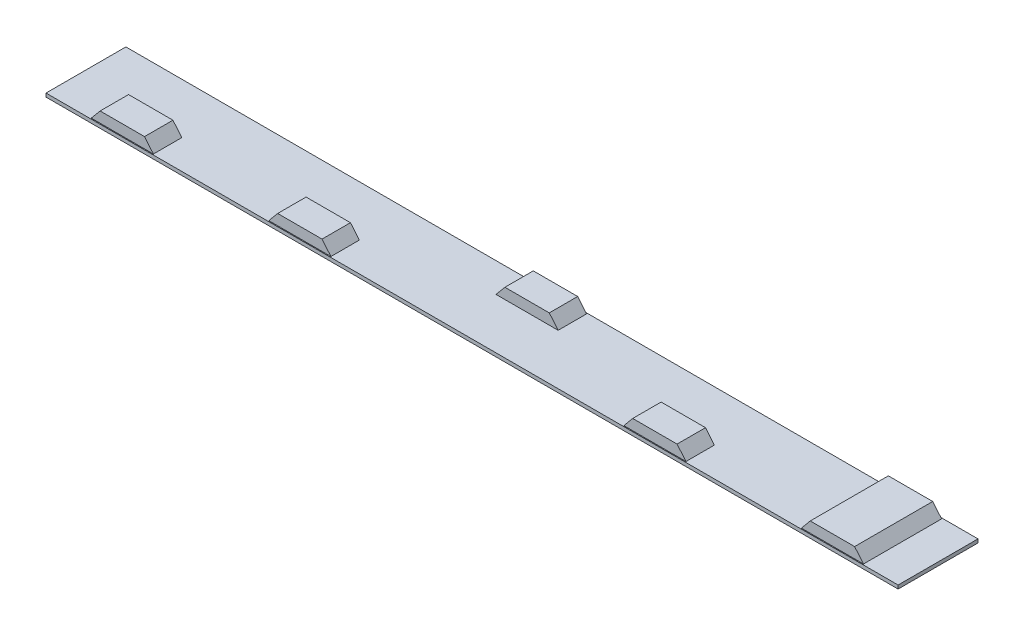
ISO-10303-21;
HEADER;
FILE_DESCRIPTION(('STEP AP214'),'2;1');
FILE_NAME('part.step','',(''),(''),'','','');
FILE_SCHEMA(('AUTOMOTIVE_DESIGN { 1 0 10303 214 1 1 1 1 }'));
ENDSEC;
DATA;
#1=APPLICATION_CONTEXT('core data for automotive mechanical design processes');
#2=APPLICATION_PROTOCOL_DEFINITION('international standard','automotive_design',2000,#1);
#3=PRODUCT_CONTEXT('',#1,'mechanical');
#4=PRODUCT('Part','Part','',(#3));
#5=PRODUCT_RELATED_PRODUCT_CATEGORY('part','',(#4));
#6=PRODUCT_DEFINITION_FORMATION('','',#4);
#7=PRODUCT_DEFINITION_CONTEXT('part definition',#1,'design');
#8=PRODUCT_DEFINITION('design','',#6,#7);
#9=PRODUCT_DEFINITION_SHAPE('','',#8);
#10=(LENGTH_UNIT() NAMED_UNIT(*) SI_UNIT(.MILLI.,.METRE.));
#11=(NAMED_UNIT(*) PLANE_ANGLE_UNIT() SI_UNIT($,.RADIAN.));
#12=(NAMED_UNIT(*) SI_UNIT($,.STERADIAN.) SOLID_ANGLE_UNIT());
#13=UNCERTAINTY_MEASURE_WITH_UNIT(LENGTH_MEASURE(1.E-05),#10,'distance_accuracy_value','');
#14=(GEOMETRIC_REPRESENTATION_CONTEXT(3) GLOBAL_UNCERTAINTY_ASSIGNED_CONTEXT((#13)) GLOBAL_UNIT_ASSIGNED_CONTEXT((#10,
#11,#12)) REPRESENTATION_CONTEXT('',''));
#15=CARTESIAN_POINT('',(0.,0.,0.));
#16=DIRECTION('',(0.,0.,1.));
#17=DIRECTION('',(1.,0.,0.));
#18=AXIS2_PLACEMENT_3D('',#15,#16,#17);
#19=CARTESIAN_POINT('',(0.,10.,0.));
#20=DIRECTION('',(0.,-1.,0.));
#21=DIRECTION('',(0.,0.,-1.));
#22=AXIS2_PLACEMENT_3D('',#19,#20,#21);
#23=PLANE('',#22);
#24=DIRECTION('',(0.,0.,-1.));
#25=VECTOR('',#24,1.);
#26=CARTESIAN_POINT('',(1100.,10.0000000000105,110.));
#27=LINE('',#26,#25);
#28=CARTESIAN_POINT('',(1100.00000000001,10.,110.));
#29=VERTEX_POINT('',#28);
#30=CARTESIAN_POINT('',(1100.00000000001,10.,-110.));
#31=VERTEX_POINT('',#30);
#32=EDGE_CURVE('E62',#29,#31,#27,.T.);
#33=ORIENTED_EDGE('',*,*,#32,.F.);
#34=DIRECTION('',(1.,0.,0.));
#35=VECTOR('',#34,1.);
#36=CARTESIAN_POINT('',(0.,10.0000000000105,110.));
#37=LINE('',#36,#35);
#38=CARTESIAN_POINT('',(924.999999999992,10.,110.));
#39=VERTEX_POINT('',#38);
#40=EDGE_CURVE('E57',#39,#29,#37,.T.);
#41=ORIENTED_EDGE('',*,*,#40,.F.);
#42=DIRECTION('',(0.,0.,-1.));
#43=VECTOR('',#42,1.);
#44=CARTESIAN_POINT('',(925.000000000001,10.0000000000105,110.));
#45=LINE('',#44,#43);
#46=CARTESIAN_POINT('',(925.000000000001,10.0000000000105,-110.));
#47=VERTEX_POINT('',#46);
#48=EDGE_CURVE('E212',#39,#47,#45,.T.);
#49=ORIENTED_EDGE('',*,*,#48,.T.);
#50=DIRECTION('',(1.,0.,0.));
#51=VECTOR('',#50,1.);
#52=CARTESIAN_POINT('',(0.,10.0000000000105,-110.));
#53=LINE('',#52,#51);
#54=EDGE_CURVE('E221',#47,#31,#53,.T.);
#55=ORIENTED_EDGE('',*,*,#54,.T.);
#56=EDGE_LOOP('',(#33,#41,#49,#55));
#57=FACE_BOUND('',#56,.T.);
#58=DIRECTION('',(0.,0.,-1.));
#59=VECTOR('',#58,1.);
#60=CARTESIAN_POINT('',(600.000000000001,10.0000000000105,110.));
#61=LINE('',#60,#59);
#62=CARTESIAN_POINT('',(600.000000000009,10.,110.));
#63=VERTEX_POINT('',#62);
#64=CARTESIAN_POINT('',(600.000000000009,10.,30.));
#65=VERTEX_POINT('',#64);
#66=EDGE_CURVE('E263',#63,#65,#61,.T.);
#67=ORIENTED_EDGE('',*,*,#66,.F.);
#68=DIRECTION('',(1.,0.,0.));
#69=VECTOR('',#68,1.);
#70=CARTESIAN_POINT('',(0.,10.0000000000105,110.));
#71=LINE('',#70,#69);
#72=CARTESIAN_POINT('',(424.999999999992,10.,110.));
#73=VERTEX_POINT('',#72);
#74=EDGE_CURVE('E247',#73,#63,#71,.T.);
#75=ORIENTED_EDGE('',*,*,#74,.F.);
#76=DIRECTION('',(0.,0.,-1.));
#77=VECTOR('',#76,1.);
#78=CARTESIAN_POINT('',(425.000000000001,10.0000000000105,110.));
#79=LINE('',#78,#77);
#80=CARTESIAN_POINT('',(425.000000000001,10.0000000000105,30.));
#81=VERTEX_POINT('',#80);
#82=EDGE_CURVE('E266',#73,#81,#79,.T.);
#83=ORIENTED_EDGE('',*,*,#82,.T.);
#84=DIRECTION('',(1.,0.,0.));
#85=VECTOR('',#84,1.);
#86=CARTESIAN_POINT('',(0.,10.0000000000105,30.));
#87=LINE('',#86,#85);
#88=EDGE_CURVE('E258',#81,#65,#87,.T.);
#89=ORIENTED_EDGE('',*,*,#88,.T.);
#90=EDGE_LOOP('',(#67,#75,#83,#89));
#91=FACE_BOUND('',#90,.T.);
#92=DIRECTION('',(0.,0.,1.));
#93=VECTOR('',#92,1.);
#94=CARTESIAN_POINT('',(-74.9999999999993,9.99999999999651,-110.));
#95=LINE('',#94,#93);
#96=CARTESIAN_POINT('',(-74.9999999999964,10.,-110.));
#97=VERTEX_POINT('',#96);
#98=CARTESIAN_POINT('',(-74.9999999999993,10.,-30.));
#99=VERTEX_POINT('',#98);
#100=EDGE_CURVE('E284',#97,#99,#95,.T.);
#101=ORIENTED_EDGE('',*,*,#100,.F.);
#102=DIRECTION('',(1.,0.,0.));
#103=VECTOR('',#102,1.);
#104=CARTESIAN_POINT('',(-74.9999999999993,9.99999999999651,-110.));
#105=LINE('',#104,#103);
#106=CARTESIAN_POINT('',(99.9999999999979,10.,-110.));
#107=VERTEX_POINT('',#106);
#108=EDGE_CURVE('E275',#97,#107,#105,.T.);
#109=ORIENTED_EDGE('',*,*,#108,.T.);
#110=DIRECTION('',(0.,0.,1.));
#111=VECTOR('',#110,1.);
#112=CARTESIAN_POINT('',(100.000000000001,9.99999999999651,-110.));
#113=LINE('',#112,#111);
#114=CARTESIAN_POINT('',(100.000000000001,9.99999999999651,-30.));
#115=VERTEX_POINT('',#114);
#116=EDGE_CURVE('E300',#107,#115,#113,.T.);
#117=ORIENTED_EDGE('',*,*,#116,.T.);
#118=DIRECTION('',(1.,0.,0.));
#119=VECTOR('',#118,1.);
#120=CARTESIAN_POINT('',(-74.9999999999993,9.99999999999651,-30.));
#121=LINE('',#120,#119);
#122=EDGE_CURVE('E287',#99,#115,#121,.T.);
#123=ORIENTED_EDGE('',*,*,#122,.F.);
#124=EDGE_LOOP('',(#101,#109,#117,#123));
#125=FACE_BOUND('',#124,.T.);
#126=DIRECTION('',(0.,0.,-1.));
#127=VECTOR('',#126,1.);
#128=CARTESIAN_POINT('',(-399.999999999999,9.99999999999302,110.));
#129=LINE('',#128,#127);
#130=CARTESIAN_POINT('',(-400.000000000005,10.,110.));
#131=VERTEX_POINT('',#130);
#132=CARTESIAN_POINT('',(-399.999999999999,10.,30.));
#133=VERTEX_POINT('',#132);
#134=EDGE_CURVE('E327',#131,#133,#129,.T.);
#135=ORIENTED_EDGE('',*,*,#134,.F.);
#136=DIRECTION('',(1.,0.,0.));
#137=VECTOR('',#136,1.);
#138=CARTESIAN_POINT('',(-574.999999999999,9.99999999999302,110.));
#139=LINE('',#138,#137);
#140=CARTESIAN_POINT('',(-574.999999999993,10.,110.));
#141=VERTEX_POINT('',#140);
#142=EDGE_CURVE('E311',#141,#131,#139,.T.);
#143=ORIENTED_EDGE('',*,*,#142,.F.);
#144=DIRECTION('',(0.,0.,-1.));
#145=VECTOR('',#144,1.);
#146=CARTESIAN_POINT('',(-574.999999999999,9.99999999999302,110.));
#147=LINE('',#146,#145);
#148=CARTESIAN_POINT('',(-574.999999999999,9.99999999999302,30.));
#149=VERTEX_POINT('',#148);
#150=EDGE_CURVE('E330',#141,#149,#147,.T.);
#151=ORIENTED_EDGE('',*,*,#150,.T.);
#152=DIRECTION('',(1.,0.,0.));
#153=VECTOR('',#152,1.);
#154=CARTESIAN_POINT('',(-574.999999999999,9.99999999999302,30.));
#155=LINE('',#154,#153);
#156=EDGE_CURVE('E322',#149,#133,#155,.T.);
#157=ORIENTED_EDGE('',*,*,#156,.T.);
#158=EDGE_LOOP('',(#135,#143,#151,#157));
#159=FACE_BOUND('',#158,.T.);
#160=DIRECTION('',(0.,0.,1.));
#161=VECTOR('',#160,1.);
#162=CARTESIAN_POINT('',(-1200.,10.,-112.5));
#163=LINE('',#162,#161);
#164=CARTESIAN_POINT('',(-1200.,10.,-112.5));
#165=VERTEX_POINT('',#164);
#166=CARTESIAN_POINT('',(-1200.,10.,112.5));
#167=VERTEX_POINT('',#166);
#168=EDGE_CURVE('E366',#165,#167,#163,.T.);
#169=ORIENTED_EDGE('',*,*,#168,.T.);
#170=DIRECTION('',(1.,0.,0.));
#171=VECTOR('',#170,1.);
#172=CARTESIAN_POINT('',(1200.,10.,112.5));
#173=LINE('',#172,#171);
#174=CARTESIAN_POINT('',(1200.,10.,112.5));
#175=VERTEX_POINT('',#174);
#176=EDGE_CURVE('E369',#167,#175,#173,.T.);
#177=ORIENTED_EDGE('',*,*,#176,.T.);
#178=DIRECTION('',(0.,0.,-1.));
#179=VECTOR('',#178,1.);
#180=CARTESIAN_POINT('',(1200.,10.,-112.5));
#181=LINE('',#180,#179);
#182=CARTESIAN_POINT('',(1200.,10.,-112.5));
#183=VERTEX_POINT('',#182);
#184=EDGE_CURVE('E372',#175,#183,#181,.T.);
#185=ORIENTED_EDGE('',*,*,#184,.T.);
#186=DIRECTION('',(-1.,0.,0.));
#187=VECTOR('',#186,1.);
#188=CARTESIAN_POINT('',(1200.,10.,-112.5));
#189=LINE('',#188,#187);
#190=EDGE_CURVE('E374',#183,#165,#189,.T.);
#191=ORIENTED_EDGE('',*,*,#190,.T.);
#192=EDGE_LOOP('',(#169,#177,#185,#191));
#193=FACE_BOUND('',#192,.T.);
#194=DIRECTION('',(1.,0.,0.));
#195=VECTOR('',#194,1.);
#196=CARTESIAN_POINT('',(-1075.,9.99999999998953,110.));
#197=LINE('',#196,#195);
#198=CARTESIAN_POINT('',(-1075.,9.99999999998953,110.));
#199=VERTEX_POINT('',#198);
#200=CARTESIAN_POINT('',(-899.999999999999,9.99999999998953,110.));
#201=VERTEX_POINT('',#200);
#202=EDGE_CURVE('E338',#199,#201,#197,.T.);
#203=ORIENTED_EDGE('',*,*,#202,.F.);
#204=DIRECTION('',(0.,0.,-1.));
#205=VECTOR('',#204,1.);
#206=CARTESIAN_POINT('',(-1075.,9.99999999998953,110.));
#207=LINE('',#206,#205);
#208=CARTESIAN_POINT('',(-1075.,9.99999999998953,30.));
#209=VERTEX_POINT('',#208);
#210=EDGE_CURVE('E362',#199,#209,#207,.T.);
#211=ORIENTED_EDGE('',*,*,#210,.T.);
#212=DIRECTION('',(1.,0.,0.));
#213=VECTOR('',#212,1.);
#214=CARTESIAN_POINT('',(-1075.,9.99999999998953,30.));
#215=LINE('',#214,#213);
#216=CARTESIAN_POINT('',(-899.999999999999,10.,30.));
#217=VERTEX_POINT('',#216);
#218=EDGE_CURVE('E348',#209,#217,#215,.T.);
#219=ORIENTED_EDGE('',*,*,#218,.T.);
#220=DIRECTION('',(0.,0.,-1.));
#221=VECTOR('',#220,1.);
#222=CARTESIAN_POINT('',(-899.999999999999,9.99999999998953,110.));
#223=LINE('',#222,#221);
#224=EDGE_CURVE('E359',#201,#217,#223,.T.);
#225=ORIENTED_EDGE('',*,*,#224,.F.);
#226=EDGE_LOOP('',(#203,#211,#219,#225));
#227=FACE_BOUND('',#226,.T.);
#228=ADVANCED_FACE('F42',(#57,#91,#125,#159,#193,#227),#23,.F.);
#229=CARTESIAN_POINT('',(-1200.,10.,-112.5));
#230=DIRECTION('',(1.,0.,0.));
#231=DIRECTION('',(0.,0.,-1.));
#232=AXIS2_PLACEMENT_3D('',#229,#230,#231);
#233=PLANE('',#232);
#234=DIRECTION('',(0.,0.,1.));
#235=VECTOR('',#234,1.);
#236=CARTESIAN_POINT('',(-1200.,0.,-112.5));
#237=LINE('',#236,#235);
#238=CARTESIAN_POINT('',(-1200.,0.,-112.5));
#239=VERTEX_POINT('',#238);
#240=CARTESIAN_POINT('',(-1200.,0.,112.5));
#241=VERTEX_POINT('',#240);
#242=EDGE_CURVE('E365',#239,#241,#237,.T.);
#243=ORIENTED_EDGE('',*,*,#242,.T.);
#244=DIRECTION('',(0.,-1.,0.));
#245=VECTOR('',#244,1.);
#246=CARTESIAN_POINT('',(-1200.,10.,112.5));
#247=LINE('',#246,#245);
#248=EDGE_CURVE('E11',#167,#241,#247,.T.);
#249=ORIENTED_EDGE('',*,*,#248,.F.);
#250=ORIENTED_EDGE('',*,*,#168,.F.);
#251=DIRECTION('',(0.,-1.,0.));
#252=VECTOR('',#251,1.);
#253=CARTESIAN_POINT('',(-1200.,10.,-112.5));
#254=LINE('',#253,#252);
#255=EDGE_CURVE('E376',#165,#239,#254,.T.);
#256=ORIENTED_EDGE('',*,*,#255,.T.);
#257=EDGE_LOOP('',(#243,#249,#250,#256));
#258=FACE_BOUND('',#257,.T.);
#259=ADVANCED_FACE('F44',(#258),#233,.F.);
#260=CARTESIAN_POINT('',(1200.,10.,112.5));
#261=DIRECTION('',(0.,0.,-1.));
#262=DIRECTION('',(-1.,0.,0.));
#263=AXIS2_PLACEMENT_3D('',#260,#261,#262);
#264=PLANE('',#263);
#265=DIRECTION('',(1.,0.,0.));
#266=VECTOR('',#265,1.);
#267=CARTESIAN_POINT('',(1200.,0.,112.5));
#268=LINE('',#267,#266);
#269=CARTESIAN_POINT('',(1200.,0.,112.5));
#270=VERTEX_POINT('',#269);
#271=EDGE_CURVE('E379',#241,#270,#268,.T.);
#272=ORIENTED_EDGE('',*,*,#271,.T.);
#273=DIRECTION('',(0.,-1.,0.));
#274=VECTOR('',#273,1.);
#275=CARTESIAN_POINT('',(1200.,10.,112.5));
#276=LINE('',#275,#274);
#277=EDGE_CURVE('E50',#175,#270,#276,.T.);
#278=ORIENTED_EDGE('',*,*,#277,.F.);
#279=ORIENTED_EDGE('',*,*,#176,.F.);
#280=ORIENTED_EDGE('',*,*,#248,.T.);
#281=EDGE_LOOP('',(#272,#278,#279,#280));
#282=FACE_BOUND('',#281,.T.);
#283=ADVANCED_FACE('F409',(#282),#264,.F.);
#284=CARTESIAN_POINT('',(1200.,10.,-112.5));
#285=DIRECTION('',(-1.,0.,0.));
#286=DIRECTION('',(0.,0.,1.));
#287=AXIS2_PLACEMENT_3D('',#284,#285,#286);
#288=PLANE('',#287);
#289=DIRECTION('',(0.,0.,-1.));
#290=VECTOR('',#289,1.);
#291=CARTESIAN_POINT('',(1200.,0.,-112.5));
#292=LINE('',#291,#290);
#293=CARTESIAN_POINT('',(1200.,0.,-112.5));
#294=VERTEX_POINT('',#293);
#295=EDGE_CURVE('E381',#270,#294,#292,.T.);
#296=ORIENTED_EDGE('',*,*,#295,.T.);
#297=DIRECTION('',(0.,-1.,0.));
#298=VECTOR('',#297,1.);
#299=CARTESIAN_POINT('',(1200.,10.,-112.5));
#300=LINE('',#299,#298);
#301=EDGE_CURVE('E386',#183,#294,#300,.T.);
#302=ORIENTED_EDGE('',*,*,#301,.F.);
#303=ORIENTED_EDGE('',*,*,#184,.F.);
#304=ORIENTED_EDGE('',*,*,#277,.T.);
#305=EDGE_LOOP('',(#296,#302,#303,#304));
#306=FACE_BOUND('',#305,.T.);
#307=ADVANCED_FACE('F393',(#306),#288,.F.);
#308=CARTESIAN_POINT('',(1200.,10.,-112.5));
#309=DIRECTION('',(0.,0.,1.));
#310=DIRECTION('',(1.,0.,0.));
#311=AXIS2_PLACEMENT_3D('',#308,#309,#310);
#312=PLANE('',#311);
#313=DIRECTION('',(-1.,0.,0.));
#314=VECTOR('',#313,1.);
#315=CARTESIAN_POINT('',(1200.,0.,-112.5));
#316=LINE('',#315,#314);
#317=EDGE_CURVE('E370',#294,#239,#316,.T.);
#318=ORIENTED_EDGE('',*,*,#317,.T.);
#319=ORIENTED_EDGE('',*,*,#255,.F.);
#320=ORIENTED_EDGE('',*,*,#190,.F.);
#321=ORIENTED_EDGE('',*,*,#301,.T.);
#322=EDGE_LOOP('',(#318,#319,#320,#321));
#323=FACE_BOUND('',#322,.T.);
#324=ADVANCED_FACE('F402',(#323),#312,.F.);
#325=CARTESIAN_POINT('',(0.,0.,0.));
#326=DIRECTION('',(0.,-1.,0.));
#327=DIRECTION('',(0.,0.,-1.));
#328=AXIS2_PLACEMENT_3D('',#325,#326,#327);
#329=PLANE('',#328);
#330=ORIENTED_EDGE('',*,*,#242,.F.);
#331=ORIENTED_EDGE('',*,*,#317,.F.);
#332=ORIENTED_EDGE('',*,*,#295,.F.);
#333=ORIENTED_EDGE('',*,*,#271,.F.);
#334=EDGE_LOOP('',(#330,#331,#332,#333));
#335=FACE_BOUND('',#334,.T.);
#336=ADVANCED_FACE('F399',(#335),#329,.T.);
#337=CARTESIAN_POINT('',(-1050.,39.9999999999895,110.));
#338=DIRECTION('',(0.768221279597377,-0.640184399664479,0.));
#339=DIRECTION('',(0.640184399664479,0.768221279597377,0.));
#340=AXIS2_PLACEMENT_3D('',#337,#338,#339);
#341=PLANE('',#340);
#342=DIRECTION('',(-0.640184399664479,-0.768221279597377,0.));
#343=VECTOR('',#342,1.);
#344=CARTESIAN_POINT('',(-1050.,39.9999999999895,30.));
#345=LINE('',#344,#343);
#346=CARTESIAN_POINT('',(-1050.,39.9999999999895,30.));
#347=VERTEX_POINT('',#346);
#348=EDGE_CURVE('E335',#347,#209,#345,.T.);
#349=ORIENTED_EDGE('',*,*,#348,.T.);
#350=ORIENTED_EDGE('',*,*,#210,.F.);
#351=DIRECTION('',(-0.640184399664479,-0.768221279597377,0.));
#352=VECTOR('',#351,1.);
#353=CARTESIAN_POINT('',(-1050.,39.9999999999895,110.));
#354=LINE('',#353,#352);
#355=CARTESIAN_POINT('',(-1050.,39.9999999999895,110.));
#356=VERTEX_POINT('',#355);
#357=EDGE_CURVE('E336',#356,#199,#354,.T.);
#358=ORIENTED_EDGE('',*,*,#357,.F.);
#359=DIRECTION('',(0.,0.,-1.));
#360=VECTOR('',#359,1.);
#361=CARTESIAN_POINT('',(-1050.,39.9999999999895,110.));
#362=LINE('',#361,#360);
#363=EDGE_CURVE('E345',#356,#347,#362,.T.);
#364=ORIENTED_EDGE('',*,*,#363,.T.);
#365=EDGE_LOOP('',(#349,#350,#358,#364));
#366=FACE_BOUND('',#365,.T.);
#367=ADVANCED_FACE('F423',(#366),#341,.F.);
#368=CARTESIAN_POINT('',(-899.999999999999,9.99999999998953,110.));
#369=DIRECTION('',(-0.768221279597375,-0.64018439966448,0.));
#370=DIRECTION('',(0.64018439966448,-0.768221279597376,0.));
#371=AXIS2_PLACEMENT_3D('',#368,#369,#370);
#372=PLANE('',#371);
#373=DIRECTION('',(-0.64018439966448,0.768221279597375,0.));
#374=VECTOR('',#373,1.);
#375=CARTESIAN_POINT('',(-899.999999999999,9.99999999998953,30.));
#376=LINE('',#375,#374);
#377=CARTESIAN_POINT('',(-924.999999999999,39.9999999999895,30.));
#378=VERTEX_POINT('',#377);
#379=EDGE_CURVE('E351',#217,#378,#376,.T.);
#380=ORIENTED_EDGE('',*,*,#379,.T.);
#381=DIRECTION('',(0.,0.,-1.));
#382=VECTOR('',#381,1.);
#383=CARTESIAN_POINT('',(-924.999999999999,39.9999999999895,110.));
#384=LINE('',#383,#382);
#385=CARTESIAN_POINT('',(-924.999999999999,39.9999999999895,110.));
#386=VERTEX_POINT('',#385);
#387=EDGE_CURVE('E356',#386,#378,#384,.T.);
#388=ORIENTED_EDGE('',*,*,#387,.F.);
#389=DIRECTION('',(-0.64018439966448,0.768221279597375,0.));
#390=VECTOR('',#389,1.);
#391=CARTESIAN_POINT('',(-899.999999999999,9.99999999998953,110.));
#392=LINE('',#391,#390);
#393=EDGE_CURVE('E341',#201,#386,#392,.T.);
#394=ORIENTED_EDGE('',*,*,#393,.F.);
#395=ORIENTED_EDGE('',*,*,#224,.T.);
#396=EDGE_LOOP('',(#380,#388,#394,#395));
#397=FACE_BOUND('',#396,.T.);
#398=ADVANCED_FACE('F442',(#397),#372,.F.);
#399=CARTESIAN_POINT('',(-924.999999999999,39.9999999999895,110.));
#400=DIRECTION('',(0.,-1.,0.));
#401=DIRECTION('',(0.,0.,-1.));
#402=AXIS2_PLACEMENT_3D('',#399,#400,#401);
#403=PLANE('',#402);
#404=DIRECTION('',(-1.,0.,0.));
#405=VECTOR('',#404,1.);
#406=CARTESIAN_POINT('',(-924.999999999999,39.9999999999895,30.));
#407=LINE('',#406,#405);
#408=EDGE_CURVE('E339',#378,#347,#407,.T.);
#409=ORIENTED_EDGE('',*,*,#408,.T.);
#410=ORIENTED_EDGE('',*,*,#363,.F.);
#411=DIRECTION('',(-1.,0.,0.));
#412=VECTOR('',#411,1.);
#413=CARTESIAN_POINT('',(-924.999999999999,39.9999999999895,110.));
#414=LINE('',#413,#412);
#415=EDGE_CURVE('E343',#386,#356,#414,.T.);
#416=ORIENTED_EDGE('',*,*,#415,.F.);
#417=ORIENTED_EDGE('',*,*,#387,.T.);
#418=EDGE_LOOP('',(#409,#410,#416,#417));
#419=FACE_BOUND('',#418,.T.);
#420=ADVANCED_FACE('F449',(#419),#403,.F.);
#421=CARTESIAN_POINT('',(0.,0.,110.));
#422=DIRECTION('',(0.,0.,-1.));
#423=DIRECTION('',(-1.,0.,0.));
#424=AXIS2_PLACEMENT_3D('',#421,#422,#423);
#425=PLANE('',#424);
#426=ORIENTED_EDGE('',*,*,#357,.T.);
#427=ORIENTED_EDGE('',*,*,#202,.T.);
#428=ORIENTED_EDGE('',*,*,#393,.T.);
#429=ORIENTED_EDGE('',*,*,#415,.T.);
#430=EDGE_LOOP('',(#426,#427,#428,#429));
#431=FACE_BOUND('',#430,.T.);
#432=ADVANCED_FACE('F456',(#431),#425,.F.);
#433=CARTESIAN_POINT('',(0.,0.,30.));
#434=DIRECTION('',(0.,0.,-1.));
#435=DIRECTION('',(-1.,0.,0.));
#436=AXIS2_PLACEMENT_3D('',#433,#434,#435);
#437=PLANE('',#436);
#438=ORIENTED_EDGE('',*,*,#348,.F.);
#439=ORIENTED_EDGE('',*,*,#408,.F.);
#440=ORIENTED_EDGE('',*,*,#379,.F.);
#441=ORIENTED_EDGE('',*,*,#218,.F.);
#442=EDGE_LOOP('',(#438,#439,#440,#441));
#443=FACE_BOUND('',#442,.T.);
#444=ADVANCED_FACE('F464',(#443),#437,.T.);
#445=CARTESIAN_POINT('',(-424.999999999999,39.999999999993,110.));
#446=DIRECTION('',(0.,-1.,0.));
#447=DIRECTION('',(0.,0.,-1.));
#448=AXIS2_PLACEMENT_3D('',#445,#446,#447);
#449=PLANE('',#448);
#450=DIRECTION('',(-1.,0.,0.));
#451=VECTOR('',#450,1.);
#452=CARTESIAN_POINT('',(-424.999999999999,39.999999999993,30.));
#453=LINE('',#452,#451);
#454=CARTESIAN_POINT('',(-424.999999999999,39.999999999993,30.));
#455=VERTEX_POINT('',#454);
#456=CARTESIAN_POINT('',(-549.999999999999,39.999999999993,30.));
#457=VERTEX_POINT('',#456);
#458=EDGE_CURVE('E297',#455,#457,#453,.T.);
#459=ORIENTED_EDGE('',*,*,#458,.T.);
#460=DIRECTION('',(0.,0.,-1.));
#461=VECTOR('',#460,1.);
#462=CARTESIAN_POINT('',(-549.999999999999,39.999999999993,110.));
#463=LINE('',#462,#461);
#464=CARTESIAN_POINT('',(-549.999999999999,39.999999999993,110.));
#465=VERTEX_POINT('',#464);
#466=EDGE_CURVE('E332',#465,#457,#463,.T.);
#467=ORIENTED_EDGE('',*,*,#466,.F.);
#468=DIRECTION('',(-1.,0.,0.));
#469=VECTOR('',#468,1.);
#470=CARTESIAN_POINT('',(-424.999999999999,39.999999999993,110.));
#471=LINE('',#470,#469);
#472=CARTESIAN_POINT('',(-424.999999999999,39.999999999993,110.));
#473=VERTEX_POINT('',#472);
#474=EDGE_CURVE('E304',#473,#465,#471,.T.);
#475=ORIENTED_EDGE('',*,*,#474,.F.);
#476=DIRECTION('',(0.,0.,-1.));
#477=VECTOR('',#476,1.);
#478=CARTESIAN_POINT('',(-424.999999999999,39.999999999993,110.));
#479=LINE('',#478,#477);
#480=EDGE_CURVE('E316',#473,#455,#479,.T.);
#481=ORIENTED_EDGE('',*,*,#480,.T.);
#482=EDGE_LOOP('',(#459,#467,#475,#481));
#483=FACE_BOUND('',#482,.T.);
#484=ADVANCED_FACE('F472',(#483),#449,.F.);
#485=CARTESIAN_POINT('',(-549.999999999999,39.999999999993,110.));
#486=DIRECTION('',(0.768221279597376,-0.64018439966448,0.));
#487=DIRECTION('',(0.64018439966448,0.768221279597376,0.));
#488=AXIS2_PLACEMENT_3D('',#485,#486,#487);
#489=PLANE('',#488);
#490=DIRECTION('',(-0.64018439966448,-0.768221279597375,0.));
#491=VECTOR('',#490,1.);
#492=CARTESIAN_POINT('',(-549.999999999999,39.999999999993,30.));
#493=LINE('',#492,#491);
#494=EDGE_CURVE('E319',#457,#149,#493,.T.);
#495=ORIENTED_EDGE('',*,*,#494,.T.);
#496=ORIENTED_EDGE('',*,*,#150,.F.);
#497=DIRECTION('',(-0.64018439966448,-0.768221279597375,0.));
#498=VECTOR('',#497,1.);
#499=CARTESIAN_POINT('',(-549.999999999999,39.999999999993,110.));
#500=LINE('',#499,#498);
#501=EDGE_CURVE('E307',#465,#141,#500,.T.);
#502=ORIENTED_EDGE('',*,*,#501,.F.);
#503=ORIENTED_EDGE('',*,*,#466,.T.);
#504=EDGE_LOOP('',(#495,#496,#502,#503));
#505=FACE_BOUND('',#504,.T.);
#506=ADVANCED_FACE('F480',(#505),#489,.F.);
#507=CARTESIAN_POINT('',(-399.999999999999,9.99999999999302,110.));
#508=DIRECTION('',(-0.768221279597376,-0.64018439966448,0.));
#509=DIRECTION('',(0.64018439966448,-0.768221279597376,0.));
#510=AXIS2_PLACEMENT_3D('',#507,#508,#509);
#511=PLANE('',#510);
#512=DIRECTION('',(-0.64018439966448,0.768221279597375,0.));
#513=VECTOR('',#512,1.);
#514=CARTESIAN_POINT('',(-399.999999999999,9.99999999999302,30.));
#515=LINE('',#514,#513);
#516=EDGE_CURVE('E308',#133,#455,#515,.T.);
#517=ORIENTED_EDGE('',*,*,#516,.T.);
#518=ORIENTED_EDGE('',*,*,#480,.F.);
#519=DIRECTION('',(-0.64018439966448,0.768221279597375,0.));
#520=VECTOR('',#519,1.);
#521=CARTESIAN_POINT('',(-399.999999999999,9.99999999999302,110.));
#522=LINE('',#521,#520);
#523=EDGE_CURVE('E314',#131,#473,#522,.T.);
#524=ORIENTED_EDGE('',*,*,#523,.F.);
#525=ORIENTED_EDGE('',*,*,#134,.T.);
#526=EDGE_LOOP('',(#517,#518,#524,#525));
#527=FACE_BOUND('',#526,.T.);
#528=ADVANCED_FACE('F488',(#527),#511,.F.);
#529=CARTESIAN_POINT('',(0.,0.,110.));
#530=DIRECTION('',(0.,0.,1.));
#531=DIRECTION('',(1.,0.,0.));
#532=AXIS2_PLACEMENT_3D('',#529,#530,#531);
#533=PLANE('',#532);
#534=ORIENTED_EDGE('',*,*,#474,.T.);
#535=ORIENTED_EDGE('',*,*,#501,.T.);
#536=ORIENTED_EDGE('',*,*,#142,.T.);
#537=ORIENTED_EDGE('',*,*,#523,.T.);
#538=EDGE_LOOP('',(#534,#535,#536,#537));
#539=FACE_BOUND('',#538,.T.);
#540=ADVANCED_FACE('F496',(#539),#533,.T.);
#541=CARTESIAN_POINT('',(0.,0.,30.));
#542=DIRECTION('',(0.,0.,1.));
#543=DIRECTION('',(1.,0.,0.));
#544=AXIS2_PLACEMENT_3D('',#541,#542,#543);
#545=PLANE('',#544);
#546=ORIENTED_EDGE('',*,*,#458,.F.);
#547=ORIENTED_EDGE('',*,*,#516,.F.);
#548=ORIENTED_EDGE('',*,*,#156,.F.);
#549=ORIENTED_EDGE('',*,*,#494,.F.);
#550=EDGE_LOOP('',(#546,#547,#548,#549));
#551=FACE_BOUND('',#550,.T.);
#552=ADVANCED_FACE('F504',(#551),#545,.F.);
#553=CARTESIAN_POINT('',(-49.9999999999993,39.9999999999965,-110.));
#554=DIRECTION('',(-0.768221279597375,0.64018439966448,0.));
#555=DIRECTION('',(-0.64018439966448,-0.768221279597376,0.));
#556=AXIS2_PLACEMENT_3D('',#553,#554,#555);
#557=PLANE('',#556);
#558=DIRECTION('',(-0.64018439966448,-0.768221279597375,0.));
#559=VECTOR('',#558,1.);
#560=CARTESIAN_POINT('',(-49.9999999999993,39.9999999999965,-30.));
#561=LINE('',#560,#559);
#562=CARTESIAN_POINT('',(-49.9999999999993,39.9999999999965,-30.));
#563=VERTEX_POINT('',#562);
#564=EDGE_CURVE('E271',#563,#99,#561,.T.);
#565=ORIENTED_EDGE('',*,*,#564,.F.);
#566=DIRECTION('',(0.,0.,1.));
#567=VECTOR('',#566,1.);
#568=CARTESIAN_POINT('',(-49.9999999999993,39.9999999999965,-110.));
#569=LINE('',#568,#567);
#570=CARTESIAN_POINT('',(-49.9999999999993,39.9999999999965,-110.));
#571=VERTEX_POINT('',#570);
#572=EDGE_CURVE('E295',#571,#563,#569,.T.);
#573=ORIENTED_EDGE('',*,*,#572,.F.);
#574=DIRECTION('',(-0.64018439966448,-0.768221279597375,0.));
#575=VECTOR('',#574,1.);
#576=CARTESIAN_POINT('',(-49.9999999999993,39.9999999999965,-110.));
#577=LINE('',#576,#575);
#578=EDGE_CURVE('E272',#571,#97,#577,.T.);
#579=ORIENTED_EDGE('',*,*,#578,.T.);
#580=ORIENTED_EDGE('',*,*,#100,.T.);
#581=EDGE_LOOP('',(#565,#573,#579,#580));
#582=FACE_BOUND('',#581,.T.);
#583=ADVANCED_FACE('F512',(#582),#557,.T.);
#584=CARTESIAN_POINT('',(75.0000000000007,39.9999999999965,-110.));
#585=DIRECTION('',(0.,1.,0.));
#586=DIRECTION('',(0.,0.,1.));
#587=AXIS2_PLACEMENT_3D('',#584,#585,#586);
#588=PLANE('',#587);
#589=DIRECTION('',(-1.,0.,0.));
#590=VECTOR('',#589,1.);
#591=CARTESIAN_POINT('',(75.0000000000007,39.9999999999965,-30.));
#592=LINE('',#591,#590);
#593=CARTESIAN_POINT('',(75.0000000000007,39.9999999999965,-30.));
#594=VERTEX_POINT('',#593);
#595=EDGE_CURVE('E276',#594,#563,#592,.T.);
#596=ORIENTED_EDGE('',*,*,#595,.F.);
#597=DIRECTION('',(0.,0.,1.));
#598=VECTOR('',#597,1.);
#599=CARTESIAN_POINT('',(75.0000000000007,39.9999999999965,-110.));
#600=LINE('',#599,#598);
#601=CARTESIAN_POINT('',(75.0000000000007,39.9999999999965,-110.));
#602=VERTEX_POINT('',#601);
#603=EDGE_CURVE('E298',#602,#594,#600,.T.);
#604=ORIENTED_EDGE('',*,*,#603,.F.);
#605=DIRECTION('',(-1.,0.,0.));
#606=VECTOR('',#605,1.);
#607=CARTESIAN_POINT('',(75.0000000000007,39.9999999999965,-110.));
#608=LINE('',#607,#606);
#609=EDGE_CURVE('E281',#602,#571,#608,.T.);
#610=ORIENTED_EDGE('',*,*,#609,.T.);
#611=ORIENTED_EDGE('',*,*,#572,.T.);
#612=EDGE_LOOP('',(#596,#604,#610,#611));
#613=FACE_BOUND('',#612,.T.);
#614=ADVANCED_FACE('F520',(#613),#588,.T.);
#615=CARTESIAN_POINT('',(100.000000000001,9.99999999999651,-110.));
#616=DIRECTION('',(0.768221279597375,0.64018439966448,0.));
#617=DIRECTION('',(-0.64018439966448,0.768221279597376,0.));
#618=AXIS2_PLACEMENT_3D('',#615,#616,#617);
#619=PLANE('',#618);
#620=DIRECTION('',(-0.64018439966448,0.768221279597375,0.));
#621=VECTOR('',#620,1.);
#622=CARTESIAN_POINT('',(100.000000000001,9.99999999999651,-30.));
#623=LINE('',#622,#621);
#624=EDGE_CURVE('E290',#115,#594,#623,.T.);
#625=ORIENTED_EDGE('',*,*,#624,.F.);
#626=ORIENTED_EDGE('',*,*,#116,.F.);
#627=DIRECTION('',(-0.64018439966448,0.768221279597375,0.));
#628=VECTOR('',#627,1.);
#629=CARTESIAN_POINT('',(100.000000000001,9.99999999999651,-110.));
#630=LINE('',#629,#628);
#631=EDGE_CURVE('E278',#107,#602,#630,.T.);
#632=ORIENTED_EDGE('',*,*,#631,.T.);
#633=ORIENTED_EDGE('',*,*,#603,.T.);
#634=EDGE_LOOP('',(#625,#626,#632,#633));
#635=FACE_BOUND('',#634,.T.);
#636=ADVANCED_FACE('F528',(#635),#619,.T.);
#637=CARTESIAN_POINT('',(0.,0.,-110.));
#638=DIRECTION('',(0.,0.,-1.));
#639=DIRECTION('',(-1.,0.,0.));
#640=AXIS2_PLACEMENT_3D('',#637,#638,#639);
#641=PLANE('',#640);
#642=ORIENTED_EDGE('',*,*,#578,.F.);
#643=ORIENTED_EDGE('',*,*,#609,.F.);
#644=ORIENTED_EDGE('',*,*,#631,.F.);
#645=ORIENTED_EDGE('',*,*,#108,.F.);
#646=EDGE_LOOP('',(#642,#643,#644,#645));
#647=FACE_BOUND('',#646,.T.);
#648=ADVANCED_FACE('F536',(#647),#641,.T.);
#649=CARTESIAN_POINT('',(0.,0.,-30.));
#650=DIRECTION('',(0.,0.,-1.));
#651=DIRECTION('',(-1.,0.,0.));
#652=AXIS2_PLACEMENT_3D('',#649,#650,#651);
#653=PLANE('',#652);
#654=ORIENTED_EDGE('',*,*,#564,.T.);
#655=ORIENTED_EDGE('',*,*,#122,.T.);
#656=ORIENTED_EDGE('',*,*,#624,.T.);
#657=ORIENTED_EDGE('',*,*,#595,.T.);
#658=EDGE_LOOP('',(#654,#655,#656,#657));
#659=FACE_BOUND('',#658,.T.);
#660=ADVANCED_FACE('F544',(#659),#653,.F.);
#661=CARTESIAN_POINT('',(0.,40.0000000000105,110.));
#662=DIRECTION('',(0.,-1.,0.));
#663=DIRECTION('',(0.,0.,-1.));
#664=AXIS2_PLACEMENT_3D('',#661,#662,#663);
#665=PLANE('',#664);
#666=DIRECTION('',(-1.,0.,0.));
#667=VECTOR('',#666,1.);
#668=CARTESIAN_POINT('',(0.,40.0000000000105,30.));
#669=LINE('',#668,#667);
#670=CARTESIAN_POINT('',(575.000000000001,40.0000000000105,30.));
#671=VERTEX_POINT('',#670);
#672=CARTESIAN_POINT('',(450.000000000001,40.0000000000105,30.));
#673=VERTEX_POINT('',#672);
#674=EDGE_CURVE('E211',#671,#673,#669,.T.);
#675=ORIENTED_EDGE('',*,*,#674,.T.);
#676=DIRECTION('',(0.,0.,-1.));
#677=VECTOR('',#676,1.);
#678=CARTESIAN_POINT('',(450.000000000001,40.0000000000105,110.));
#679=LINE('',#678,#677);
#680=CARTESIAN_POINT('',(450.000000000001,40.0000000000105,110.));
#681=VERTEX_POINT('',#680);
#682=EDGE_CURVE('E268',#681,#673,#679,.T.);
#683=ORIENTED_EDGE('',*,*,#682,.F.);
#684=DIRECTION('',(-1.,0.,0.));
#685=VECTOR('',#684,1.);
#686=CARTESIAN_POINT('',(0.,40.0000000000105,110.));
#687=LINE('',#686,#685);
#688=CARTESIAN_POINT('',(575.000000000001,40.0000000000105,110.));
#689=VERTEX_POINT('',#688);
#690=EDGE_CURVE('E240',#689,#681,#687,.T.);
#691=ORIENTED_EDGE('',*,*,#690,.F.);
#692=DIRECTION('',(0.,0.,-1.));
#693=VECTOR('',#692,1.);
#694=CARTESIAN_POINT('',(575.000000000001,40.0000000000105,110.));
#695=LINE('',#694,#693);
#696=EDGE_CURVE('E252',#689,#671,#695,.T.);
#697=ORIENTED_EDGE('',*,*,#696,.T.);
#698=EDGE_LOOP('',(#675,#683,#691,#697));
#699=FACE_BOUND('',#698,.T.);
#700=ADVANCED_FACE('F552',(#699),#665,.F.);
#701=CARTESIAN_POINT('',(245.901639344258,-204.918032786881,110.));
#702=DIRECTION('',(0.768221279597377,-0.640184399664479,0.));
#703=DIRECTION('',(0.640184399664479,0.768221279597377,0.));
#704=AXIS2_PLACEMENT_3D('',#701,#702,#703);
#705=PLANE('',#704);
#706=DIRECTION('',(-0.640184399664479,-0.768221279597377,0.));
#707=VECTOR('',#706,1.);
#708=CARTESIAN_POINT('',(245.901639344258,-204.918032786881,30.));
#709=LINE('',#708,#707);
#710=EDGE_CURVE('E255',#673,#81,#709,.T.);
#711=ORIENTED_EDGE('',*,*,#710,.T.);
#712=ORIENTED_EDGE('',*,*,#82,.F.);
#713=DIRECTION('',(-0.640184399664479,-0.768221279597377,0.));
#714=VECTOR('',#713,1.);
#715=CARTESIAN_POINT('',(245.901639344258,-204.918032786881,110.));
#716=LINE('',#715,#714);
#717=EDGE_CURVE('E243',#681,#73,#716,.T.);
#718=ORIENTED_EDGE('',*,*,#717,.F.);
#719=ORIENTED_EDGE('',*,*,#682,.T.);
#720=EDGE_LOOP('',(#711,#712,#718,#719));
#721=FACE_BOUND('',#720,.T.);
#722=ADVANCED_FACE('F560',(#721),#705,.F.);
#723=CARTESIAN_POINT('',(359.016393442628,299.180327868857,110.));
#724=DIRECTION('',(-0.768221279597376,-0.64018439966448,0.));
#725=DIRECTION('',(0.64018439966448,-0.768221279597376,0.));
#726=AXIS2_PLACEMENT_3D('',#723,#724,#725);
#727=PLANE('',#726);
#728=DIRECTION('',(-0.64018439966448,0.768221279597376,0.));
#729=VECTOR('',#728,1.);
#730=CARTESIAN_POINT('',(359.016393442628,299.180327868857,30.));
#731=LINE('',#730,#729);
#732=EDGE_CURVE('E244',#65,#671,#731,.T.);
#733=ORIENTED_EDGE('',*,*,#732,.T.);
#734=ORIENTED_EDGE('',*,*,#696,.F.);
#735=DIRECTION('',(-0.64018439966448,0.768221279597376,0.));
#736=VECTOR('',#735,1.);
#737=CARTESIAN_POINT('',(359.016393442628,299.180327868857,110.));
#738=LINE('',#737,#736);
#739=EDGE_CURVE('E250',#63,#689,#738,.T.);
#740=ORIENTED_EDGE('',*,*,#739,.F.);
#741=ORIENTED_EDGE('',*,*,#66,.T.);
#742=EDGE_LOOP('',(#733,#734,#740,#741));
#743=FACE_BOUND('',#742,.T.);
#744=ADVANCED_FACE('F568',(#743),#727,.F.);
#745=CARTESIAN_POINT('',(0.,0.,110.));
#746=DIRECTION('',(0.,0.,1.));
#747=DIRECTION('',(1.,0.,0.));
#748=AXIS2_PLACEMENT_3D('',#745,#746,#747);
#749=PLANE('',#748);
#750=ORIENTED_EDGE('',*,*,#690,.T.);
#751=ORIENTED_EDGE('',*,*,#717,.T.);
#752=ORIENTED_EDGE('',*,*,#74,.T.);
#753=ORIENTED_EDGE('',*,*,#739,.T.);
#754=EDGE_LOOP('',(#750,#751,#752,#753));
#755=FACE_BOUND('',#754,.T.);
#756=ADVANCED_FACE('F576',(#755),#749,.T.);
#757=CARTESIAN_POINT('',(0.,0.,30.));
#758=DIRECTION('',(0.,0.,1.));
#759=DIRECTION('',(1.,0.,0.));
#760=AXIS2_PLACEMENT_3D('',#757,#758,#759);
#761=PLANE('',#760);
#762=ORIENTED_EDGE('',*,*,#674,.F.);
#763=ORIENTED_EDGE('',*,*,#732,.F.);
#764=ORIENTED_EDGE('',*,*,#88,.F.);
#765=ORIENTED_EDGE('',*,*,#710,.F.);
#766=EDGE_LOOP('',(#762,#763,#764,#765));
#767=FACE_BOUND('',#766,.T.);
#768=ADVANCED_FACE('F584',(#767),#761,.F.);
#769=CARTESIAN_POINT('',(0.,40.0000000000105,110.));
#770=DIRECTION('',(0.,-1.,0.));
#771=DIRECTION('',(0.,0.,-1.));
#772=AXIS2_PLACEMENT_3D('',#769,#770,#771);
#773=PLANE('',#772);
#774=DIRECTION('',(0.,0.,-1.));
#775=VECTOR('',#774,1.);
#776=CARTESIAN_POINT('',(1075.,40.0000000000106,110.));
#777=LINE('',#776,#775);
#778=CARTESIAN_POINT('',(1075.,40.0000000000106,110.));
#779=VERTEX_POINT('',#778);
#780=CARTESIAN_POINT('',(1075.,40.0000000000106,-110.));
#781=VERTEX_POINT('',#780);
#782=EDGE_CURVE('E225',#779,#781,#777,.T.);
#783=ORIENTED_EDGE('',*,*,#782,.T.);
#784=DIRECTION('',(-1.,0.,0.));
#785=VECTOR('',#784,1.);
#786=CARTESIAN_POINT('',(0.,40.0000000000105,-110.));
#787=LINE('',#786,#785);
#788=CARTESIAN_POINT('',(950.000000000001,40.0000000000105,-110.));
#789=VERTEX_POINT('',#788);
#790=EDGE_CURVE('E219',#781,#789,#787,.T.);
#791=ORIENTED_EDGE('',*,*,#790,.T.);
#792=DIRECTION('',(0.,0.,-1.));
#793=VECTOR('',#792,1.);
#794=CARTESIAN_POINT('',(950.000000000001,40.0000000000105,110.));
#795=LINE('',#794,#793);
#796=CARTESIAN_POINT('',(950.000000000001,40.0000000000105,110.));
#797=VERTEX_POINT('',#796);
#798=EDGE_CURVE('E201',#797,#789,#795,.T.);
#799=ORIENTED_EDGE('',*,*,#798,.F.);
#800=DIRECTION('',(-1.,0.,0.));
#801=VECTOR('',#800,1.);
#802=CARTESIAN_POINT('',(0.,40.0000000000105,110.));
#803=LINE('',#802,#801);
#804=EDGE_CURVE('E231',#779,#797,#803,.T.);
#805=ORIENTED_EDGE('',*,*,#804,.F.);
#806=EDGE_LOOP('',(#783,#791,#799,#805));
#807=FACE_BOUND('',#806,.T.);
#808=ADVANCED_FACE('F223',(#807),#773,.F.);
#809=CARTESIAN_POINT('',(540.983606557374,-450.819672131143,110.));
#810=DIRECTION('',(0.768221279597377,-0.640184399664479,0.));
#811=DIRECTION('',(0.640184399664479,0.768221279597377,0.));
#812=AXIS2_PLACEMENT_3D('',#809,#810,#811);
#813=PLANE('',#812);
#814=ORIENTED_EDGE('',*,*,#798,.T.);
#815=DIRECTION('',(-0.640184399664479,-0.768221279597377,0.));
#816=VECTOR('',#815,1.);
#817=CARTESIAN_POINT('',(540.983606557374,-450.819672131143,-110.));
#818=LINE('',#817,#816);
#819=EDGE_CURVE('E205',#789,#47,#818,.T.);
#820=ORIENTED_EDGE('',*,*,#819,.T.);
#821=ORIENTED_EDGE('',*,*,#48,.F.);
#822=DIRECTION('',(-0.640184399664479,-0.768221279597377,0.));
#823=VECTOR('',#822,1.);
#824=CARTESIAN_POINT('',(540.983606557374,-450.819672131143,110.));
#825=LINE('',#824,#823);
#826=EDGE_CURVE('E206',#797,#39,#825,.T.);
#827=ORIENTED_EDGE('',*,*,#826,.F.);
#828=EDGE_LOOP('',(#814,#820,#821,#827));
#829=FACE_BOUND('',#828,.T.);
#830=ADVANCED_FACE('F203',(#829),#813,.F.);
#831=CARTESIAN_POINT('',(654.09836065574,545.08196721312,110.));
#832=DIRECTION('',(-0.768221279597374,-0.640184399664482,0.));
#833=DIRECTION('',(0.640184399664482,-0.768221279597374,0.));
#834=AXIS2_PLACEMENT_3D('',#831,#832,#833);
#835=PLANE('',#834);
#836=ORIENTED_EDGE('',*,*,#32,.T.);
#837=DIRECTION('',(-0.640184399664482,0.768221279597374,0.));
#838=VECTOR('',#837,1.);
#839=CARTESIAN_POINT('',(654.09836065574,545.08196721312,-110.));
#840=LINE('',#839,#838);
#841=EDGE_CURVE('E229',#31,#781,#840,.T.);
#842=ORIENTED_EDGE('',*,*,#841,.T.);
#843=ORIENTED_EDGE('',*,*,#782,.F.);
#844=DIRECTION('',(-0.640184399664482,0.768221279597374,0.));
#845=VECTOR('',#844,1.);
#846=CARTESIAN_POINT('',(654.09836065574,545.08196721312,110.));
#847=LINE('',#846,#845);
#848=EDGE_CURVE('E235',#29,#779,#847,.T.);
#849=ORIENTED_EDGE('',*,*,#848,.F.);
#850=EDGE_LOOP('',(#836,#842,#843,#849));
#851=FACE_BOUND('',#850,.T.);
#852=ADVANCED_FACE('F605',(#851),#835,.F.);
#853=CARTESIAN_POINT('',(0.,0.,110.));
#854=DIRECTION('',(0.,0.,1.));
#855=DIRECTION('',(1.,0.,0.));
#856=AXIS2_PLACEMENT_3D('',#853,#854,#855);
#857=PLANE('',#856);
#858=ORIENTED_EDGE('',*,*,#804,.T.);
#859=ORIENTED_EDGE('',*,*,#826,.T.);
#860=ORIENTED_EDGE('',*,*,#40,.T.);
#861=ORIENTED_EDGE('',*,*,#848,.T.);
#862=EDGE_LOOP('',(#858,#859,#860,#861));
#863=FACE_BOUND('',#862,.T.);
#864=ADVANCED_FACE('F612',(#863),#857,.T.);
#865=CARTESIAN_POINT('',(0.,0.,-110.));
#866=DIRECTION('',(0.,0.,1.));
#867=DIRECTION('',(1.,0.,0.));
#868=AXIS2_PLACEMENT_3D('',#865,#866,#867);
#869=PLANE('',#868);
#870=ORIENTED_EDGE('',*,*,#790,.F.);
#871=ORIENTED_EDGE('',*,*,#841,.F.);
#872=ORIENTED_EDGE('',*,*,#54,.F.);
#873=ORIENTED_EDGE('',*,*,#819,.F.);
#874=EDGE_LOOP('',(#870,#871,#872,#873));
#875=FACE_BOUND('',#874,.T.);
#876=ADVANCED_FACE('F217',(#875),#869,.F.);
#877=CLOSED_SHELL('',(#228,#259,#283,#307,#324,#336,#367,#398,#420,#432,#444,#484,#506,#528,
#540,#552,#583,#614,#636,#648,#660,#700,#722,#744,#756,#768,#808,#830,#852,#864,#876));
#878=MANIFOLD_SOLID_BREP('B2',#877);
#879=ADVANCED_BREP_SHAPE_REPRESENTATION('',(#18,#878),#14);
#880=SHAPE_DEFINITION_REPRESENTATION(#9,#879);
ENDSEC;
END-ISO-10303-21;
